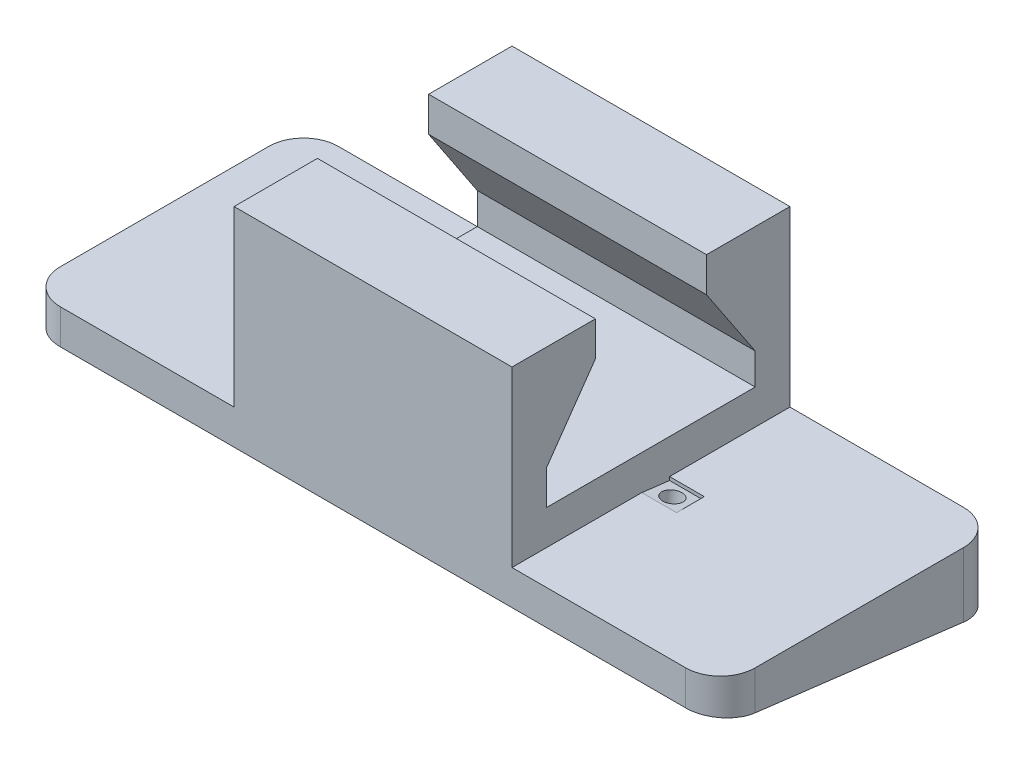
ISO-10303-21;
HEADER;
FILE_DESCRIPTION(('STEP AP214'),'2;1');
FILE_NAME('part.step','',(''),(''),'','','');
FILE_SCHEMA(('AUTOMOTIVE_DESIGN { 1 0 10303 214 1 1 1 1 }'));
ENDSEC;
DATA;
#1=APPLICATION_CONTEXT('core data for automotive mechanical design processes');
#2=APPLICATION_PROTOCOL_DEFINITION('international standard','automotive_design',2000,#1);
#3=PRODUCT_CONTEXT('',#1,'mechanical');
#4=PRODUCT('Part','Part','',(#3));
#5=PRODUCT_RELATED_PRODUCT_CATEGORY('part','',(#4));
#6=PRODUCT_DEFINITION_FORMATION('','',#4);
#7=PRODUCT_DEFINITION_CONTEXT('part definition',#1,'design');
#8=PRODUCT_DEFINITION('design','',#6,#7);
#9=PRODUCT_DEFINITION_SHAPE('','',#8);
#10=(LENGTH_UNIT() NAMED_UNIT(*) SI_UNIT(.MILLI.,.METRE.));
#11=(NAMED_UNIT(*) PLANE_ANGLE_UNIT() SI_UNIT($,.RADIAN.));
#12=(NAMED_UNIT(*) SI_UNIT($,.STERADIAN.) SOLID_ANGLE_UNIT());
#13=UNCERTAINTY_MEASURE_WITH_UNIT(LENGTH_MEASURE(1.E-05),#10,'distance_accuracy_value','');
#14=(GEOMETRIC_REPRESENTATION_CONTEXT(3) GLOBAL_UNCERTAINTY_ASSIGNED_CONTEXT((#13)) GLOBAL_UNIT_ASSIGNED_CONTEXT((#10,
#11,#12)) REPRESENTATION_CONTEXT('',''));
#15=CARTESIAN_POINT('',(0.,0.,0.));
#16=DIRECTION('',(0.,0.,1.));
#17=DIRECTION('',(1.,0.,0.));
#18=AXIS2_PLACEMENT_3D('',#15,#16,#17);
#19=CARTESIAN_POINT('',(19.9999999999999,5.,1.32059979258647));
#20=DIRECTION('',(0.,-0.992546151641323,0.121869343405141));
#21=DIRECTION('',(0.,-0.121869343405141,-0.992546151641323));
#22=AXIS2_PLACEMENT_3D('',#19,#20,#21);
#23=PLANE('',#22);
#24=CARTESIAN_POINT('',(22.5,4.76599831311448,-0.585191010139714));
#25=DIRECTION('',(0.,-0.992546151641323,0.121869343405141));
#26=DIRECTION('',(0.,-0.121869343405141,-0.992546151641323));
#27=AXIS2_PLACEMENT_3D('',#24,#25,#26);
#28=CIRCLE('',#27,1.4);
#29=CARTESIAN_POINT('',(22.5,4.59538123234729,-1.97475562243757));
#30=VERTEX_POINT('',#29);
#31=EDGE_CURVE('E303',#30,#30,#28,.F.);
#32=ORIENTED_EDGE('',*,*,#31,.F.);
#33=EDGE_LOOP('',(#32));
#34=FACE_BOUND('',#33,.T.);
#35=DIRECTION('',(0.,-0.121869343405141,-0.992546151641323));
#36=VECTOR('',#35,1.);
#37=CARTESIAN_POINT('',(24.9999999999999,5.,1.32059979258647));
#38=LINE('',#37,#36);
#39=CARTESIAN_POINT('',(24.9999999999999,5.,1.32059979258647));
#40=VERTEX_POINT('',#39);
#41=CARTESIAN_POINT('',(24.9999999999999,4.50886175638841,-2.67940020741353));
#42=VERTEX_POINT('',#41);
#43=EDGE_CURVE('E557',#40,#42,#38,.T.);
#44=ORIENTED_EDGE('',*,*,#43,.T.);
#45=DIRECTION('',(1.,0.,0.));
#46=VECTOR('',#45,1.);
#47=CARTESIAN_POINT('',(19.9999999999999,4.50886175638841,-2.67940020741353));
#48=LINE('',#47,#46);
#49=CARTESIAN_POINT('',(19.9999999999999,4.50886175638841,-2.67940020741353));
#50=VERTEX_POINT('',#49);
#51=EDGE_CURVE('E222',#50,#42,#48,.T.);
#52=ORIENTED_EDGE('',*,*,#51,.F.);
#53=DIRECTION('',(0.,-0.121869343405141,-0.992546151641323));
#54=VECTOR('',#53,1.);
#55=CARTESIAN_POINT('',(19.9999999999999,5.,1.32059979258647));
#56=LINE('',#55,#54);
#57=CARTESIAN_POINT('',(19.9999999999999,5.,1.32059979258647));
#58=VERTEX_POINT('',#57);
#59=EDGE_CURVE('E217',#58,#50,#56,.T.);
#60=ORIENTED_EDGE('',*,*,#59,.F.);
#61=DIRECTION('',(1.,0.,0.));
#62=VECTOR('',#61,1.);
#63=CARTESIAN_POINT('',(19.9999999999999,5.,1.32059979258647));
#64=LINE('',#63,#62);
#65=EDGE_CURVE('E219',#58,#40,#64,.T.);
#66=ORIENTED_EDGE('',*,*,#65,.T.);
#67=EDGE_LOOP('',(#44,#52,#60,#66));
#68=FACE_BOUND('',#67,.T.);
#69=ADVANCED_FACE('F42',(#34,#68),#23,.F.);
#70=CARTESIAN_POINT('',(19.9999999999999,4.50886175638841,-2.67940020741353));
#71=DIRECTION('',(0.,0.,-1.));
#72=DIRECTION('',(-1.,0.,0.));
#73=AXIS2_PLACEMENT_3D('',#70,#71,#72);
#74=PLANE('',#73);
#75=DIRECTION('',(0.,1.,0.));
#76=VECTOR('',#75,1.);
#77=CARTESIAN_POINT('',(24.9999999999999,4.50886175638841,-2.67940020741353));
#78=LINE('',#77,#76);
#79=CARTESIAN_POINT('',(24.9999999999999,5.,-2.67940020741353));
#80=VERTEX_POINT('',#79);
#81=EDGE_CURVE('E556',#42,#80,#78,.T.);
#82=ORIENTED_EDGE('',*,*,#81,.T.);
#83=DIRECTION('',(1.,0.,0.));
#84=VECTOR('',#83,1.);
#85=CARTESIAN_POINT('',(19.9999999999999,5.,-2.67940020741353));
#86=LINE('',#85,#84);
#87=CARTESIAN_POINT('',(20.,5.,-2.67940020741353));
#88=VERTEX_POINT('',#87);
#89=EDGE_CURVE('E227',#88,#80,#86,.T.);
#90=ORIENTED_EDGE('',*,*,#89,.F.);
#91=DIRECTION('',(0.,1.,0.));
#92=VECTOR('',#91,1.);
#93=CARTESIAN_POINT('',(19.9999999999999,4.50886175638841,-2.67940020741353));
#94=LINE('',#93,#92);
#95=EDGE_CURVE('E228',#50,#88,#94,.T.);
#96=ORIENTED_EDGE('',*,*,#95,.F.);
#97=ORIENTED_EDGE('',*,*,#51,.T.);
#98=EDGE_LOOP('',(#82,#90,#96,#97));
#99=FACE_BOUND('',#98,.T.);
#100=ADVANCED_FACE('F611',(#99),#74,.F.);
#101=CARTESIAN_POINT('',(-20.0000000000001,4.50886175638838,-2.65364059148094));
#102=DIRECTION('',(0.,-0.992546151641322,0.121869343405148));
#103=DIRECTION('',(0.,-0.121869343405148,-0.992546151641322));
#104=AXIS2_PLACEMENT_3D('',#101,#102,#103);
#105=PLANE('',#104);
#106=CARTESIAN_POINT('',(-22.5,4.76288240555631,-0.584808424798369));
#107=DIRECTION('',(0.,-0.992546151641322,0.121869343405148));
#108=DIRECTION('',(0.,-0.121869343405148,-0.992546151641322));
#109=AXIS2_PLACEMENT_3D('',#106,#107,#108);
#110=CIRCLE('',#109,1.4);
#111=CARTESIAN_POINT('',(-22.5,4.5922653247891,-1.97437303709622));
#112=VERTEX_POINT('',#111);
#113=EDGE_CURVE('E297',#112,#112,#110,.F.);
#114=ORIENTED_EDGE('',*,*,#113,.F.);
#115=EDGE_LOOP('',(#114));
#116=FACE_BOUND('',#115,.T.);
#117=DIRECTION('',(0.,0.121869343405148,0.992546151641322));
#118=VECTOR('',#117,1.);
#119=CARTESIAN_POINT('',(-25.0000000000001,4.50886175638838,-2.65364059148094));
#120=LINE('',#119,#118);
#121=CARTESIAN_POINT('',(-25.0000000000001,4.50886175638838,-2.65364059148094));
#122=VERTEX_POINT('',#121);
#123=CARTESIAN_POINT('',(-25.0000000000001,5.,1.34635940851906));
#124=VERTEX_POINT('',#123);
#125=EDGE_CURVE('E574',#122,#124,#120,.T.);
#126=ORIENTED_EDGE('',*,*,#125,.T.);
#127=DIRECTION('',(-1.,0.,0.));
#128=VECTOR('',#127,1.);
#129=CARTESIAN_POINT('',(-20.0000000000001,5.,1.34635940851906));
#130=LINE('',#129,#128);
#131=CARTESIAN_POINT('',(-20.,5.,1.34635940851906));
#132=VERTEX_POINT('',#131);
#133=EDGE_CURVE('E584',#132,#124,#130,.T.);
#134=ORIENTED_EDGE('',*,*,#133,.F.);
#135=DIRECTION('',(0.,0.121869343405148,0.992546151641322));
#136=VECTOR('',#135,1.);
#137=CARTESIAN_POINT('',(-20.0000000000001,4.50886175638838,-2.65364059148094));
#138=LINE('',#137,#136);
#139=CARTESIAN_POINT('',(-20.0000000000001,4.50886175638838,-2.65364059148094));
#140=VERTEX_POINT('',#139);
#141=EDGE_CURVE('E542',#140,#132,#138,.T.);
#142=ORIENTED_EDGE('',*,*,#141,.F.);
#143=DIRECTION('',(-1.,0.,0.));
#144=VECTOR('',#143,1.);
#145=CARTESIAN_POINT('',(-20.0000000000001,4.50886175638838,-2.65364059148094));
#146=LINE('',#145,#144);
#147=EDGE_CURVE('E581',#140,#122,#146,.T.);
#148=ORIENTED_EDGE('',*,*,#147,.T.);
#149=EDGE_LOOP('',(#126,#134,#142,#148));
#150=FACE_BOUND('',#149,.T.);
#151=ADVANCED_FACE('F617',(#116,#150),#105,.F.);
#152=CARTESIAN_POINT('',(-20.0000000000001,5.,-2.65364059148094));
#153=DIRECTION('',(0.,0.,-1.));
#154=DIRECTION('',(0.,1.,0.));
#155=AXIS2_PLACEMENT_3D('',#152,#153,#154);
#156=PLANE('',#155);
#157=DIRECTION('',(0.,-1.,0.));
#158=VECTOR('',#157,1.);
#159=CARTESIAN_POINT('',(-25.0000000000001,5.,-2.65364059148094));
#160=LINE('',#159,#158);
#161=CARTESIAN_POINT('',(-25.0000000000001,5.,-2.65364059148094));
#162=VERTEX_POINT('',#161);
#163=EDGE_CURVE('E571',#162,#122,#160,.T.);
#164=ORIENTED_EDGE('',*,*,#163,.T.);
#165=ORIENTED_EDGE('',*,*,#147,.F.);
#166=DIRECTION('',(0.,-1.,0.));
#167=VECTOR('',#166,1.);
#168=CARTESIAN_POINT('',(-20.0000000000001,5.,-2.65364059148094));
#169=LINE('',#168,#167);
#170=CARTESIAN_POINT('',(-20.0000000000001,5.,-2.65364059148094));
#171=VERTEX_POINT('',#170);
#172=EDGE_CURVE('E546',#171,#140,#169,.T.);
#173=ORIENTED_EDGE('',*,*,#172,.F.);
#174=DIRECTION('',(-1.,0.,0.));
#175=VECTOR('',#174,1.);
#176=CARTESIAN_POINT('',(-20.0000000000001,5.,-2.65364059148094));
#177=LINE('',#176,#175);
#178=EDGE_CURVE('E302',#171,#162,#177,.T.);
#179=ORIENTED_EDGE('',*,*,#178,.T.);
#180=EDGE_LOOP('',(#164,#165,#173,#179));
#181=FACE_BOUND('',#180,.T.);
#182=ADVANCED_FACE('F628',(#181),#156,.F.);
#183=CARTESIAN_POINT('',(0.,10.,0.));
#184=DIRECTION('',(0.,1.,0.));
#185=DIRECTION('',(0.,0.,1.));
#186=AXIS2_PLACEMENT_3D('',#183,#184,#185);
#187=PLANE('',#186);
#188=DIRECTION('',(0.,0.,1.));
#189=VECTOR('',#188,1.);
#190=CARTESIAN_POINT('',(-20.,10.,-20.));
#191=LINE('',#190,#189);
#192=CARTESIAN_POINT('',(-20.,10.,-15.));
#193=VERTEX_POINT('',#192);
#194=CARTESIAN_POINT('',(-20.,10.,15.));
#195=VERTEX_POINT('',#194);
#196=EDGE_CURVE('E244',#193,#195,#191,.T.);
#197=ORIENTED_EDGE('',*,*,#196,.T.);
#198=DIRECTION('',(1.,0.,0.));
#199=VECTOR('',#198,1.);
#200=CARTESIAN_POINT('',(-50.,10.,15.));
#201=LINE('',#200,#199);
#202=CARTESIAN_POINT('',(20.,10.,15.));
#203=VERTEX_POINT('',#202);
#204=EDGE_CURVE('E400',#195,#203,#201,.T.);
#205=ORIENTED_EDGE('',*,*,#204,.T.);
#206=DIRECTION('',(0.,0.,-1.));
#207=VECTOR('',#206,1.);
#208=CARTESIAN_POINT('',(20.,10.,20.));
#209=LINE('',#208,#207);
#210=CARTESIAN_POINT('',(20.,10.,-15.));
#211=VERTEX_POINT('',#210);
#212=EDGE_CURVE('E249',#203,#211,#209,.T.);
#213=ORIENTED_EDGE('',*,*,#212,.T.);
#214=DIRECTION('',(1.,0.,0.));
#215=VECTOR('',#214,1.);
#216=CARTESIAN_POINT('',(-50.,10.,-15.));
#217=LINE('',#216,#215);
#218=EDGE_CURVE('E413',#193,#211,#217,.T.);
#219=ORIENTED_EDGE('',*,*,#218,.F.);
#220=EDGE_LOOP('',(#197,#205,#213,#219));
#221=FACE_BOUND('',#220,.T.);
#222=ADVANCED_FACE('F482',(#221),#187,.T.);
#223=CARTESIAN_POINT('',(0.,5.,0.));
#224=DIRECTION('',(0.,1.,0.));
#225=DIRECTION('',(0.,0.,1.));
#226=AXIS2_PLACEMENT_3D('',#223,#224,#225);
#227=PLANE('',#226);
#228=DIRECTION('',(1.,0.,0.));
#229=VECTOR('',#228,1.);
#230=CARTESIAN_POINT('',(0.,5.,20.));
#231=LINE('',#230,#229);
#232=CARTESIAN_POINT('',(20.,5.,20.));
#233=VERTEX_POINT('',#232);
#234=CARTESIAN_POINT('',(44.9999999999999,5.,20.));
#235=VERTEX_POINT('',#234);
#236=EDGE_CURVE('E278',#233,#235,#231,.T.);
#237=ORIENTED_EDGE('',*,*,#236,.T.);
#238=CARTESIAN_POINT('',(44.9999999999999,5.,15.));
#239=DIRECTION('',(0.,1.,0.));
#240=DIRECTION('',(0.,0.,1.));
#241=AXIS2_PLACEMENT_3D('',#238,#239,#240);
#242=CIRCLE('',#241,5.);
#243=CARTESIAN_POINT('',(49.9999999999999,5.,15.));
#244=VERTEX_POINT('',#243);
#245=EDGE_CURVE('E64',#235,#244,#242,.T.);
#246=ORIENTED_EDGE('',*,*,#245,.T.);
#247=DIRECTION('',(0.,0.,1.));
#248=VECTOR('',#247,1.);
#249=CARTESIAN_POINT('',(49.9999999999999,5.,0.));
#250=LINE('',#249,#248);
#251=CARTESIAN_POINT('',(49.9999999999999,5.,-15.));
#252=VERTEX_POINT('',#251);
#253=EDGE_CURVE('E282',#252,#244,#250,.T.);
#254=ORIENTED_EDGE('',*,*,#253,.F.);
#255=CARTESIAN_POINT('',(44.9999999999999,5.,-15.));
#256=DIRECTION('',(0.,1.,0.));
#257=DIRECTION('',(0.,0.,1.));
#258=AXIS2_PLACEMENT_3D('',#255,#256,#257);
#259=CIRCLE('',#258,5.);
#260=CARTESIAN_POINT('',(44.9999999999999,5.,-20.));
#261=VERTEX_POINT('',#260);
#262=EDGE_CURVE('E58',#252,#261,#259,.T.);
#263=ORIENTED_EDGE('',*,*,#262,.T.);
#264=DIRECTION('',(1.,0.,0.));
#265=VECTOR('',#264,1.);
#266=CARTESIAN_POINT('',(0.,5.,-20.));
#267=LINE('',#266,#265);
#268=CARTESIAN_POINT('',(20.,5.,-20.));
#269=VERTEX_POINT('',#268);
#270=EDGE_CURVE('E274',#269,#261,#267,.T.);
#271=ORIENTED_EDGE('',*,*,#270,.F.);
#272=DIRECTION('',(0.,0.,-1.));
#273=VECTOR('',#272,1.);
#274=CARTESIAN_POINT('',(20.,5.,20.));
#275=LINE('',#274,#273);
#276=EDGE_CURVE('E245',#88,#269,#275,.T.);
#277=ORIENTED_EDGE('',*,*,#276,.F.);
#278=ORIENTED_EDGE('',*,*,#89,.T.);
#279=DIRECTION('',(0.,0.,1.));
#280=VECTOR('',#279,1.);
#281=CARTESIAN_POINT('',(24.9999999999999,5.,-2.67940020741353));
#282=LINE('',#281,#280);
#283=EDGE_CURVE('E236',#80,#40,#282,.T.);
#284=ORIENTED_EDGE('',*,*,#283,.T.);
#285=ORIENTED_EDGE('',*,*,#65,.F.);
#286=EDGE_CURVE('E232',#233,#58,#275,.T.);
#287=ORIENTED_EDGE('',*,*,#286,.F.);
#288=EDGE_LOOP('',(#237,#246,#254,#263,#271,#277,#278,#284,#285,#287));
#289=FACE_BOUND('',#288,.T.);
#290=ADVANCED_FACE('F231',(#289),#227,.T.);
#291=CARTESIAN_POINT('',(0.,5.,-20.));
#292=DIRECTION('',(0.,0.,-1.));
#293=DIRECTION('',(-1.,0.,0.));
#294=AXIS2_PLACEMENT_3D('',#291,#292,#293);
#295=PLANE('',#294);
#296=ORIENTED_EDGE('',*,*,#270,.T.);
#297=DIRECTION('',(0.,-1.,0.));
#298=VECTOR('',#297,1.);
#299=CARTESIAN_POINT('',(44.9999999999999,5.,-20.));
#300=LINE('',#299,#298);
#301=CARTESIAN_POINT('',(44.9999999999999,-4.91138243611591,-20.));
#302=VERTEX_POINT('',#301);
#303=EDGE_CURVE('E11',#261,#302,#300,.T.);
#304=ORIENTED_EDGE('',*,*,#303,.T.);
#305=DIRECTION('',(-1.,0.,0.));
#306=VECTOR('',#305,1.);
#307=CARTESIAN_POINT('',(49.9999999999999,-4.91138243611591,-20.));
#308=LINE('',#307,#306);
#309=CARTESIAN_POINT('',(-45.0000000000001,-4.91138243611591,-20.));
#310=VERTEX_POINT('',#309);
#311=EDGE_CURVE('E357',#302,#310,#308,.T.);
#312=ORIENTED_EDGE('',*,*,#311,.T.);
#313=DIRECTION('',(0.,-1.,0.));
#314=VECTOR('',#313,1.);
#315=CARTESIAN_POINT('',(-45.0000000000001,5.,-20.));
#316=LINE('',#315,#314);
#317=CARTESIAN_POINT('',(-45.0000000000001,5.,-20.));
#318=VERTEX_POINT('',#317);
#319=EDGE_CURVE('E51',#310,#318,#316,.F.);
#320=ORIENTED_EDGE('',*,*,#319,.T.);
#321=CARTESIAN_POINT('',(-20.,5.,-20.));
#322=VERTEX_POINT('',#321);
#323=EDGE_CURVE('E270',#318,#322,#267,.T.);
#324=ORIENTED_EDGE('',*,*,#323,.T.);
#325=DIRECTION('',(0.,-1.,0.));
#326=VECTOR('',#325,1.);
#327=CARTESIAN_POINT('',(-20.,10.,-20.));
#328=LINE('',#327,#326);
#329=CARTESIAN_POINT('',(-20.,30.,-20.));
#330=VERTEX_POINT('',#329);
#331=EDGE_CURVE('E265',#330,#322,#328,.T.);
#332=ORIENTED_EDGE('',*,*,#331,.F.);
#333=DIRECTION('',(-1.,0.,0.));
#334=VECTOR('',#333,1.);
#335=CARTESIAN_POINT('',(-20.,30.,-20.));
#336=LINE('',#335,#334);
#337=CARTESIAN_POINT('',(20.,30.,-20.));
#338=VERTEX_POINT('',#337);
#339=EDGE_CURVE('E467',#338,#330,#336,.T.);
#340=ORIENTED_EDGE('',*,*,#339,.F.);
#341=DIRECTION('',(0.,-1.,0.));
#342=VECTOR('',#341,1.);
#343=CARTESIAN_POINT('',(20.,10.,-20.));
#344=LINE('',#343,#342);
#345=EDGE_CURVE('E255',#338,#269,#344,.T.);
#346=ORIENTED_EDGE('',*,*,#345,.T.);
#347=EDGE_LOOP('',(#296,#304,#312,#320,#324,#332,#340,#346));
#348=FACE_BOUND('',#347,.T.);
#349=ADVANCED_FACE('F354',(#348),#295,.T.);
#350=CARTESIAN_POINT('',(-50.0000000000001,5.,0.));
#351=DIRECTION('',(1.,0.,0.));
#352=DIRECTION('',(0.,0.,-1.));
#353=AXIS2_PLACEMENT_3D('',#350,#351,#352);
#354=PLANE('',#353);
#355=DIRECTION('',(0.,0.121869343405141,0.992546151641323));
#356=VECTOR('',#355,1.);
#357=CARTESIAN_POINT('',(-50.0000000000001,0.,20.));
#358=LINE('',#357,#356);
#359=CARTESIAN_POINT('',(-50.0000000000001,-4.29745963160143,-15.));
#360=VERTEX_POINT('',#359);
#361=CARTESIAN_POINT('',(-50.0000000000001,-0.61392280451449,15.));
#362=VERTEX_POINT('',#361);
#363=EDGE_CURVE('E370',#360,#362,#358,.T.);
#364=ORIENTED_EDGE('',*,*,#363,.T.);
#365=DIRECTION('',(0.,-1.,0.));
#366=VECTOR('',#365,1.);
#367=CARTESIAN_POINT('',(-50.0000000000001,5.,15.));
#368=LINE('',#367,#366);
#369=CARTESIAN_POINT('',(-50.0000000000001,5.,15.));
#370=VERTEX_POINT('',#369);
#371=EDGE_CURVE('E330',#362,#370,#368,.F.);
#372=ORIENTED_EDGE('',*,*,#371,.T.);
#373=DIRECTION('',(0.,0.,1.));
#374=VECTOR('',#373,1.);
#375=CARTESIAN_POINT('',(-50.0000000000001,5.,0.));
#376=LINE('',#375,#374);
#377=CARTESIAN_POINT('',(-50.0000000000001,5.,-15.));
#378=VERTEX_POINT('',#377);
#379=EDGE_CURVE('E273',#378,#370,#376,.T.);
#380=ORIENTED_EDGE('',*,*,#379,.F.);
#381=DIRECTION('',(0.,-1.,0.));
#382=VECTOR('',#381,1.);
#383=CARTESIAN_POINT('',(-50.0000000000001,-4.91138243611591,-15.));
#384=LINE('',#383,#382);
#385=EDGE_CURVE('E326',#378,#360,#384,.T.);
#386=ORIENTED_EDGE('',*,*,#385,.T.);
#387=EDGE_LOOP('',(#364,#372,#380,#386));
#388=FACE_BOUND('',#387,.T.);
#389=ADVANCED_FACE('F369',(#388),#354,.F.);
#390=CARTESIAN_POINT('',(0.,5.,20.));
#391=DIRECTION('',(0.,0.,-1.));
#392=DIRECTION('',(-1.,0.,0.));
#393=AXIS2_PLACEMENT_3D('',#390,#391,#392);
#394=PLANE('',#393);
#395=CARTESIAN_POINT('',(-45.0000000000001,5.,20.));
#396=VERTEX_POINT('',#395);
#397=CARTESIAN_POINT('',(-20.,5.,20.));
#398=VERTEX_POINT('',#397);
#399=EDGE_CURVE('E279',#396,#398,#231,.T.);
#400=ORIENTED_EDGE('',*,*,#399,.F.);
#401=DIRECTION('',(0.,-1.,0.));
#402=VECTOR('',#401,1.);
#403=CARTESIAN_POINT('',(-45.0000000000001,5.,20.));
#404=LINE('',#403,#402);
#405=CARTESIAN_POINT('',(-45.0000000000001,0.,20.));
#406=VERTEX_POINT('',#405);
#407=EDGE_CURVE('E310',#396,#406,#404,.T.);
#408=ORIENTED_EDGE('',*,*,#407,.T.);
#409=DIRECTION('',(1.,0.,0.));
#410=VECTOR('',#409,1.);
#411=CARTESIAN_POINT('',(0.,0.,20.));
#412=LINE('',#411,#410);
#413=CARTESIAN_POINT('',(44.9999999999999,0.,20.));
#414=VERTEX_POINT('',#413);
#415=EDGE_CURVE('E269',#406,#414,#412,.T.);
#416=ORIENTED_EDGE('',*,*,#415,.T.);
#417=DIRECTION('',(0.,-1.,0.));
#418=VECTOR('',#417,1.);
#419=CARTESIAN_POINT('',(44.9999999999999,5.,20.));
#420=LINE('',#419,#418);
#421=EDGE_CURVE('E296',#414,#235,#420,.F.);
#422=ORIENTED_EDGE('',*,*,#421,.T.);
#423=ORIENTED_EDGE('',*,*,#236,.F.);
#424=DIRECTION('',(0.,-1.,0.));
#425=VECTOR('',#424,1.);
#426=CARTESIAN_POINT('',(20.,10.,20.));
#427=LINE('',#426,#425);
#428=CARTESIAN_POINT('',(20.,30.,20.));
#429=VERTEX_POINT('',#428);
#430=EDGE_CURVE('E242',#429,#233,#427,.T.);
#431=ORIENTED_EDGE('',*,*,#430,.F.);
#432=DIRECTION('',(1.,0.,0.));
#433=VECTOR('',#432,1.);
#434=CARTESIAN_POINT('',(-20.,30.,20.));
#435=LINE('',#434,#433);
#436=CARTESIAN_POINT('',(-20.,30.,20.));
#437=VERTEX_POINT('',#436);
#438=EDGE_CURVE('E438',#437,#429,#435,.T.);
#439=ORIENTED_EDGE('',*,*,#438,.F.);
#440=DIRECTION('',(0.,-1.,0.));
#441=VECTOR('',#440,1.);
#442=CARTESIAN_POINT('',(-20.,10.,20.));
#443=LINE('',#442,#441);
#444=EDGE_CURVE('E261',#437,#398,#443,.T.);
#445=ORIENTED_EDGE('',*,*,#444,.T.);
#446=EDGE_LOOP('',(#400,#408,#416,#422,#423,#431,#439,#445));
#447=FACE_BOUND('',#446,.T.);
#448=ADVANCED_FACE('F517',(#447),#394,.F.);
#449=CARTESIAN_POINT('',(49.9999999999999,5.,0.));
#450=DIRECTION('',(1.,0.,0.));
#451=DIRECTION('',(0.,0.,-1.));
#452=AXIS2_PLACEMENT_3D('',#449,#450,#451);
#453=PLANE('',#452);
#454=ORIENTED_EDGE('',*,*,#253,.T.);
#455=DIRECTION('',(0.,-1.,0.));
#456=VECTOR('',#455,1.);
#457=CARTESIAN_POINT('',(49.9999999999999,0.,15.));
#458=LINE('',#457,#456);
#459=CARTESIAN_POINT('',(49.9999999999999,-0.613922804514489,15.));
#460=VERTEX_POINT('',#459);
#461=EDGE_CURVE('E342',#244,#460,#458,.T.);
#462=ORIENTED_EDGE('',*,*,#461,.T.);
#463=DIRECTION('',(0.,0.121869343405141,0.992546151641323));
#464=VECTOR('',#463,1.);
#465=CARTESIAN_POINT('',(49.9999999999999,0.,20.));
#466=LINE('',#465,#464);
#467=CARTESIAN_POINT('',(49.9999999999999,-4.29745963160143,-15.));
#468=VERTEX_POINT('',#467);
#469=EDGE_CURVE('E376',#468,#460,#466,.T.);
#470=ORIENTED_EDGE('',*,*,#469,.F.);
#471=DIRECTION('',(0.,-1.,0.));
#472=VECTOR('',#471,1.);
#473=CARTESIAN_POINT('',(49.9999999999999,5.,-15.));
#474=LINE('',#473,#472);
#475=EDGE_CURVE('E339',#468,#252,#474,.F.);
#476=ORIENTED_EDGE('',*,*,#475,.T.);
#477=EDGE_LOOP('',(#454,#462,#470,#476));
#478=FACE_BOUND('',#477,.T.);
#479=ADVANCED_FACE('F529',(#478),#453,.T.);
#480=ORIENTED_EDGE('',*,*,#379,.T.);
#481=CARTESIAN_POINT('',(-45.0000000000001,5.,15.));
#482=DIRECTION('',(0.,1.,0.));
#483=DIRECTION('',(0.,0.,1.));
#484=AXIS2_PLACEMENT_3D('',#481,#482,#483);
#485=CIRCLE('',#484,5.);
#486=EDGE_CURVE('E336',#370,#396,#485,.T.);
#487=ORIENTED_EDGE('',*,*,#486,.T.);
#488=ORIENTED_EDGE('',*,*,#399,.T.);
#489=DIRECTION('',(0.,0.,1.));
#490=VECTOR('',#489,1.);
#491=CARTESIAN_POINT('',(-20.,5.,-20.));
#492=LINE('',#491,#490);
#493=EDGE_CURVE('E478',#132,#398,#492,.T.);
#494=ORIENTED_EDGE('',*,*,#493,.F.);
#495=ORIENTED_EDGE('',*,*,#133,.T.);
#496=DIRECTION('',(0.,0.,-1.));
#497=VECTOR('',#496,1.);
#498=CARTESIAN_POINT('',(-25.0000000000001,5.,1.34635940851907));
#499=LINE('',#498,#497);
#500=EDGE_CURVE('E307',#124,#162,#499,.T.);
#501=ORIENTED_EDGE('',*,*,#500,.T.);
#502=ORIENTED_EDGE('',*,*,#178,.F.);
#503=EDGE_CURVE('E251',#322,#171,#492,.T.);
#504=ORIENTED_EDGE('',*,*,#503,.F.);
#505=ORIENTED_EDGE('',*,*,#323,.F.);
#506=CARTESIAN_POINT('',(-45.0000000000001,5.,-15.));
#507=DIRECTION('',(0.,1.,0.));
#508=DIRECTION('',(0.,0.,1.));
#509=AXIS2_PLACEMENT_3D('',#506,#507,#508);
#510=CIRCLE('',#509,5.);
#511=EDGE_CURVE('E333',#318,#378,#510,.T.);
#512=ORIENTED_EDGE('',*,*,#511,.T.);
#513=EDGE_LOOP('',(#480,#487,#488,#494,#495,#501,#502,#504,#505,#512));
#514=FACE_BOUND('',#513,.T.);
#515=ADVANCED_FACE('F361',(#514),#227,.T.);
#516=CARTESIAN_POINT('',(-20.,10.,-20.));
#517=DIRECTION('',(1.,0.,0.));
#518=DIRECTION('',(0.,0.,-1.));
#519=AXIS2_PLACEMENT_3D('',#516,#517,#518);
#520=PLANE('',#519);
#521=DIRECTION('',(0.,-1.,0.));
#522=VECTOR('',#521,1.);
#523=CARTESIAN_POINT('',(-20.,10.,15.));
#524=LINE('',#523,#522);
#525=CARTESIAN_POINT('',(-20.,15.,15.));
#526=VERTEX_POINT('',#525);
#527=EDGE_CURVE('E430',#526,#195,#524,.T.);
#528=ORIENTED_EDGE('',*,*,#527,.T.);
#529=ORIENTED_EDGE('',*,*,#196,.F.);
#530=DIRECTION('',(0.,1.,0.));
#531=VECTOR('',#530,1.);
#532=CARTESIAN_POINT('',(-20.,10.,-15.));
#533=LINE('',#532,#531);
#534=CARTESIAN_POINT('',(-20.,14.5,-15.));
#535=VERTEX_POINT('',#534);
#536=EDGE_CURVE('E426',#193,#535,#533,.T.);
#537=ORIENTED_EDGE('',*,*,#536,.T.);
#538=DIRECTION('',(0.,0.832050294337844,0.554700196225229));
#539=VECTOR('',#538,1.);
#540=CARTESIAN_POINT('',(-20.,9.07692307692308,-18.6153846153846));
#541=LINE('',#540,#539);
#542=CARTESIAN_POINT('',(-20.,25.,-8.));
#543=VERTEX_POINT('',#542);
#544=EDGE_CURVE('E422',#535,#543,#541,.T.);
#545=ORIENTED_EDGE('',*,*,#544,.T.);
#546=DIRECTION('',(0.,-1.,0.));
#547=VECTOR('',#546,1.);
#548=CARTESIAN_POINT('',(-20.,30.,-8.00000000000001));
#549=LINE('',#548,#547);
#550=CARTESIAN_POINT('',(-20.,30.,-8.00000000000001));
#551=VERTEX_POINT('',#550);
#552=EDGE_CURVE('E475',#551,#543,#549,.T.);
#553=ORIENTED_EDGE('',*,*,#552,.F.);
#554=DIRECTION('',(0.,0.,1.));
#555=VECTOR('',#554,1.);
#556=CARTESIAN_POINT('',(-20.,30.,-20.));
#557=LINE('',#556,#555);
#558=EDGE_CURVE('E456',#330,#551,#557,.T.);
#559=ORIENTED_EDGE('',*,*,#558,.F.);
#560=ORIENTED_EDGE('',*,*,#331,.T.);
#561=ORIENTED_EDGE('',*,*,#503,.T.);
#562=ORIENTED_EDGE('',*,*,#172,.T.);
#563=ORIENTED_EDGE('',*,*,#141,.T.);
#564=ORIENTED_EDGE('',*,*,#493,.T.);
#565=ORIENTED_EDGE('',*,*,#444,.F.);
#566=DIRECTION('',(0.,0.,1.));
#567=VECTOR('',#566,1.);
#568=CARTESIAN_POINT('',(-20.,30.,8.));
#569=LINE('',#568,#567);
#570=CARTESIAN_POINT('',(-20.,30.,8.));
#571=VERTEX_POINT('',#570);
#572=EDGE_CURVE('E434',#571,#437,#569,.T.);
#573=ORIENTED_EDGE('',*,*,#572,.F.);
#574=DIRECTION('',(0.,-1.,0.));
#575=VECTOR('',#574,1.);
#576=CARTESIAN_POINT('',(-20.,30.,8.));
#577=LINE('',#576,#575);
#578=CARTESIAN_POINT('',(-20.,25.,8.));
#579=VERTEX_POINT('',#578);
#580=EDGE_CURVE('E448',#571,#579,#577,.T.);
#581=ORIENTED_EDGE('',*,*,#580,.T.);
#582=DIRECTION('',(0.,-0.819231920519041,0.573462344363328));
#583=VECTOR('',#582,1.);
#584=CARTESIAN_POINT('',(-20.,28.0872483221476,5.83892617449665));
#585=LINE('',#584,#583);
#586=EDGE_CURVE('E404',#579,#526,#585,.T.);
#587=ORIENTED_EDGE('',*,*,#586,.T.);
#588=EDGE_LOOP('',(#528,#529,#537,#545,#553,#559,#560,#561,#562,#563,#564,#565,#573,#581,#587));
#589=FACE_BOUND('',#588,.T.);
#590=ADVANCED_FACE('F500',(#589),#520,.F.);
#591=CARTESIAN_POINT('',(20.,10.,20.));
#592=DIRECTION('',(-1.,0.,0.));
#593=DIRECTION('',(0.,0.,1.));
#594=AXIS2_PLACEMENT_3D('',#591,#592,#593);
#595=PLANE('',#594);
#596=ORIENTED_EDGE('',*,*,#212,.F.);
#597=DIRECTION('',(0.,-1.,0.));
#598=VECTOR('',#597,1.);
#599=CARTESIAN_POINT('',(20.,10.,15.));
#600=LINE('',#599,#598);
#601=CARTESIAN_POINT('',(20.,15.,15.));
#602=VERTEX_POINT('',#601);
#603=EDGE_CURVE('E394',#602,#203,#600,.T.);
#604=ORIENTED_EDGE('',*,*,#603,.F.);
#605=DIRECTION('',(0.,-0.819231920519041,0.573462344363328));
#606=VECTOR('',#605,1.);
#607=CARTESIAN_POINT('',(20.,15.,15.));
#608=LINE('',#607,#606);
#609=CARTESIAN_POINT('',(20.,25.,8.));
#610=VERTEX_POINT('',#609);
#611=EDGE_CURVE('E390',#610,#602,#608,.T.);
#612=ORIENTED_EDGE('',*,*,#611,.F.);
#613=DIRECTION('',(0.,-1.,0.));
#614=VECTOR('',#613,1.);
#615=CARTESIAN_POINT('',(20.,30.,8.));
#616=LINE('',#615,#614);
#617=CARTESIAN_POINT('',(20.,30.,8.));
#618=VERTEX_POINT('',#617);
#619=EDGE_CURVE('E452',#618,#610,#616,.T.);
#620=ORIENTED_EDGE('',*,*,#619,.F.);
#621=DIRECTION('',(0.,0.,-1.));
#622=VECTOR('',#621,1.);
#623=CARTESIAN_POINT('',(20.,30.,8.));
#624=LINE('',#623,#622);
#625=EDGE_CURVE('E442',#429,#618,#624,.T.);
#626=ORIENTED_EDGE('',*,*,#625,.F.);
#627=ORIENTED_EDGE('',*,*,#430,.T.);
#628=ORIENTED_EDGE('',*,*,#286,.T.);
#629=ORIENTED_EDGE('',*,*,#59,.T.);
#630=ORIENTED_EDGE('',*,*,#95,.T.);
#631=ORIENTED_EDGE('',*,*,#276,.T.);
#632=ORIENTED_EDGE('',*,*,#345,.F.);
#633=DIRECTION('',(0.,0.,-1.));
#634=VECTOR('',#633,1.);
#635=CARTESIAN_POINT('',(20.,30.,-20.));
#636=LINE('',#635,#634);
#637=CARTESIAN_POINT('',(20.,30.,-8.00000000000001));
#638=VERTEX_POINT('',#637);
#639=EDGE_CURVE('E463',#638,#338,#636,.T.);
#640=ORIENTED_EDGE('',*,*,#639,.F.);
#641=DIRECTION('',(0.,-1.,0.));
#642=VECTOR('',#641,1.);
#643=CARTESIAN_POINT('',(20.,30.,-8.00000000000001));
#644=LINE('',#643,#642);
#645=CARTESIAN_POINT('',(20.,25.,-8.));
#646=VERTEX_POINT('',#645);
#647=EDGE_CURVE('E471',#638,#646,#644,.T.);
#648=ORIENTED_EDGE('',*,*,#647,.T.);
#649=DIRECTION('',(0.,0.832050294337844,0.554700196225229));
#650=VECTOR('',#649,1.);
#651=CARTESIAN_POINT('',(20.,14.5,-15.));
#652=LINE('',#651,#650);
#653=CARTESIAN_POINT('',(20.,14.5,-15.));
#654=VERTEX_POINT('',#653);
#655=EDGE_CURVE('E410',#654,#646,#652,.T.);
#656=ORIENTED_EDGE('',*,*,#655,.F.);
#657=DIRECTION('',(0.,1.,0.));
#658=VECTOR('',#657,1.);
#659=CARTESIAN_POINT('',(20.,10.,-15.));
#660=LINE('',#659,#658);
#661=EDGE_CURVE('E389',#211,#654,#660,.T.);
#662=ORIENTED_EDGE('',*,*,#661,.F.);
#663=EDGE_LOOP('',(#596,#604,#612,#620,#626,#627,#628,#629,#630,#631,#632,#640,#648,#656,#662));
#664=FACE_BOUND('',#663,.T.);
#665=ADVANCED_FACE('F240',(#664),#595,.F.);
#666=CARTESIAN_POINT('',(-20.,30.,-8.00000000000001));
#667=DIRECTION('',(0.,0.,-1.));
#668=DIRECTION('',(-1.,0.,0.));
#669=AXIS2_PLACEMENT_3D('',#666,#667,#668);
#670=PLANE('',#669);
#671=ORIENTED_EDGE('',*,*,#552,.T.);
#672=DIRECTION('',(1.,0.,0.));
#673=VECTOR('',#672,1.);
#674=CARTESIAN_POINT('',(-20.,25.,-8.00000000000001));
#675=LINE('',#674,#673);
#676=EDGE_CURVE('E292',#543,#646,#675,.T.);
#677=ORIENTED_EDGE('',*,*,#676,.T.);
#678=ORIENTED_EDGE('',*,*,#647,.F.);
#679=DIRECTION('',(1.,0.,0.));
#680=VECTOR('',#679,1.);
#681=CARTESIAN_POINT('',(-20.,30.,-8.00000000000001));
#682=LINE('',#681,#680);
#683=EDGE_CURVE('E460',#551,#638,#682,.T.);
#684=ORIENTED_EDGE('',*,*,#683,.F.);
#685=EDGE_LOOP('',(#671,#677,#678,#684));
#686=FACE_BOUND('',#685,.T.);
#687=ADVANCED_FACE('F496',(#686),#670,.F.);
#688=CARTESIAN_POINT('',(0.,30.,0.));
#689=DIRECTION('',(0.,1.,0.));
#690=DIRECTION('',(0.,0.,1.));
#691=AXIS2_PLACEMENT_3D('',#688,#689,#690);
#692=PLANE('',#691);
#693=ORIENTED_EDGE('',*,*,#558,.T.);
#694=ORIENTED_EDGE('',*,*,#683,.T.);
#695=ORIENTED_EDGE('',*,*,#639,.T.);
#696=ORIENTED_EDGE('',*,*,#339,.T.);
#697=EDGE_LOOP('',(#693,#694,#695,#696));
#698=FACE_BOUND('',#697,.T.);
#699=ADVANCED_FACE('F548',(#698),#692,.T.);
#700=CARTESIAN_POINT('',(-20.,30.,8.));
#701=DIRECTION('',(0.,0.,1.));
#702=DIRECTION('',(1.,0.,0.));
#703=AXIS2_PLACEMENT_3D('',#700,#701,#702);
#704=PLANE('',#703);
#705=ORIENTED_EDGE('',*,*,#619,.T.);
#706=DIRECTION('',(-1.,0.,0.));
#707=VECTOR('',#706,1.);
#708=CARTESIAN_POINT('',(-20.,25.,8.));
#709=LINE('',#708,#707);
#710=EDGE_CURVE('E285',#610,#579,#709,.T.);
#711=ORIENTED_EDGE('',*,*,#710,.T.);
#712=ORIENTED_EDGE('',*,*,#580,.F.);
#713=DIRECTION('',(-1.,0.,0.));
#714=VECTOR('',#713,1.);
#715=CARTESIAN_POINT('',(-20.,30.,8.));
#716=LINE('',#715,#714);
#717=EDGE_CURVE('E445',#618,#571,#716,.T.);
#718=ORIENTED_EDGE('',*,*,#717,.F.);
#719=EDGE_LOOP('',(#705,#711,#712,#718));
#720=FACE_BOUND('',#719,.T.);
#721=ADVANCED_FACE('F509',(#720),#704,.F.);
#722=CARTESIAN_POINT('',(0.,30.,0.));
#723=DIRECTION('',(0.,1.,0.));
#724=DIRECTION('',(0.,0.,1.));
#725=AXIS2_PLACEMENT_3D('',#722,#723,#724);
#726=PLANE('',#725);
#727=ORIENTED_EDGE('',*,*,#572,.T.);
#728=ORIENTED_EDGE('',*,*,#438,.T.);
#729=ORIENTED_EDGE('',*,*,#625,.T.);
#730=ORIENTED_EDGE('',*,*,#717,.T.);
#731=EDGE_LOOP('',(#727,#728,#729,#730));
#732=FACE_BOUND('',#731,.T.);
#733=ADVANCED_FACE('F513',(#732),#726,.T.);
#734=CARTESIAN_POINT('',(-50.,10.,15.));
#735=DIRECTION('',(0.,0.,1.));
#736=DIRECTION('',(0.,-1.,0.));
#737=AXIS2_PLACEMENT_3D('',#734,#735,#736);
#738=PLANE('',#737);
#739=DIRECTION('',(1.,0.,0.));
#740=VECTOR('',#739,1.);
#741=CARTESIAN_POINT('',(-50.,15.,15.));
#742=LINE('',#741,#740);
#743=EDGE_CURVE('E399',#526,#602,#742,.T.);
#744=ORIENTED_EDGE('',*,*,#743,.T.);
#745=ORIENTED_EDGE('',*,*,#603,.T.);
#746=ORIENTED_EDGE('',*,*,#204,.F.);
#747=ORIENTED_EDGE('',*,*,#527,.F.);
#748=EDGE_LOOP('',(#744,#745,#746,#747));
#749=FACE_BOUND('',#748,.T.);
#750=ADVANCED_FACE('F502',(#749),#738,.F.);
#751=CARTESIAN_POINT('',(-50.,15.,15.));
#752=DIRECTION('',(0.,0.573462344363328,0.819231920519041));
#753=DIRECTION('',(0.,-0.819231920519041,0.573462344363328));
#754=AXIS2_PLACEMENT_3D('',#751,#752,#753);
#755=PLANE('',#754);
#756=ORIENTED_EDGE('',*,*,#710,.F.);
#757=ORIENTED_EDGE('',*,*,#611,.T.);
#758=ORIENTED_EDGE('',*,*,#743,.F.);
#759=ORIENTED_EDGE('',*,*,#586,.F.);
#760=EDGE_LOOP('',(#756,#757,#758,#759));
#761=FACE_BOUND('',#760,.T.);
#762=ADVANCED_FACE('F794',(#761),#755,.F.);
#763=CARTESIAN_POINT('',(-50.,10.,-15.));
#764=DIRECTION('',(0.,0.,-1.));
#765=DIRECTION('',(0.,1.,0.));
#766=AXIS2_PLACEMENT_3D('',#763,#764,#765);
#767=PLANE('',#766);
#768=ORIENTED_EDGE('',*,*,#218,.T.);
#769=ORIENTED_EDGE('',*,*,#661,.T.);
#770=DIRECTION('',(1.,0.,0.));
#771=VECTOR('',#770,1.);
#772=CARTESIAN_POINT('',(-50.,14.5,-15.));
#773=LINE('',#772,#771);
#774=EDGE_CURVE('E395',#535,#654,#773,.T.);
#775=ORIENTED_EDGE('',*,*,#774,.F.);
#776=ORIENTED_EDGE('',*,*,#536,.F.);
#777=EDGE_LOOP('',(#768,#769,#775,#776));
#778=FACE_BOUND('',#777,.T.);
#779=ADVANCED_FACE('F488',(#778),#767,.F.);
#780=CARTESIAN_POINT('',(-50.,14.5,-15.));
#781=DIRECTION('',(0.,0.554700196225229,-0.832050294337844));
#782=DIRECTION('',(0.,0.832050294337844,0.554700196225229));
#783=AXIS2_PLACEMENT_3D('',#780,#781,#782);
#784=PLANE('',#783);
#785=ORIENTED_EDGE('',*,*,#774,.T.);
#786=ORIENTED_EDGE('',*,*,#655,.T.);
#787=ORIENTED_EDGE('',*,*,#676,.F.);
#788=ORIENTED_EDGE('',*,*,#544,.F.);
#789=EDGE_LOOP('',(#785,#786,#787,#788));
#790=FACE_BOUND('',#789,.T.);
#791=ADVANCED_FACE('F494',(#790),#784,.F.);
#792=CARTESIAN_POINT('',(49.9999999999999,0.,20.));
#793=DIRECTION('',(0.,-0.992546151641323,0.121869343405141));
#794=DIRECTION('',(0.,-0.121869343405141,-0.992546151641323));
#795=AXIS2_PLACEMENT_3D('',#792,#793,#794);
#796=PLANE('',#795);
#797=CARTESIAN_POINT('',(-22.5,-2.41921895599655,0.297042737240004));
#798=DIRECTION('',(0.,-0.992546151641323,0.121869343405141));
#799=DIRECTION('',(0.,-0.121869343405141,-0.992546151641323));
#800=AXIS2_PLACEMENT_3D('',#797,#798,#799);
#801=CIRCLE('',#800,1.4);
#802=CARTESIAN_POINT('',(-22.5,-2.58983603676375,-1.09252187505785));
#803=VERTEX_POINT('',#802);
#804=EDGE_CURVE('E377',#803,#803,#801,.T.);
#805=ORIENTED_EDGE('',*,*,#804,.F.);
#806=EDGE_LOOP('',(#805));
#807=FACE_BOUND('',#806,.T.);
#808=CARTESIAN_POINT('',(22.5,-2.41921895599655,0.297042737240004));
#809=DIRECTION('',(0.,-0.992546151641323,0.121869343405141));
#810=DIRECTION('',(0.,-0.121869343405141,-0.992546151641323));
#811=AXIS2_PLACEMENT_3D('',#808,#809,#810);
#812=CIRCLE('',#811,1.4);
#813=CARTESIAN_POINT('',(22.5,-2.58983603676375,-1.09252187505785));
#814=VERTEX_POINT('',#813);
#815=EDGE_CURVE('E301',#814,#814,#812,.T.);
#816=ORIENTED_EDGE('',*,*,#815,.F.);
#817=EDGE_LOOP('',(#816));
#818=FACE_BOUND('',#817,.T.);
#819=ORIENTED_EDGE('',*,*,#415,.F.);
#820=CARTESIAN_POINT('',(-45.0000000000001,-0.61392280451449,15.));
#821=DIRECTION('',(0.,-0.992546151641323,0.121869343405141));
#822=DIRECTION('',(0.,-0.121869343405141,-0.992546151641323));
#823=AXIS2_PLACEMENT_3D('',#820,#821,#822);
#824=ELLIPSE('',#823,5.03754912729424,5.);
#825=EDGE_CURVE('E323',#406,#362,#824,.T.);
#826=ORIENTED_EDGE('',*,*,#825,.T.);
#827=ORIENTED_EDGE('',*,*,#363,.F.);
#828=CARTESIAN_POINT('',(-45.0000000000001,-4.29745963160143,-15.));
#829=DIRECTION('',(0.,-0.992546151641323,0.121869343405141));
#830=DIRECTION('',(0.,0.121869343405141,0.992546151641323));
#831=AXIS2_PLACEMENT_3D('',#828,#829,#830);
#832=ELLIPSE('',#831,5.03754912729424,5.);
#833=EDGE_CURVE('E314',#360,#310,#832,.T.);
#834=ORIENTED_EDGE('',*,*,#833,.T.);
#835=ORIENTED_EDGE('',*,*,#311,.F.);
#836=CARTESIAN_POINT('',(44.9999999999999,-4.29745963160143,-15.));
#837=DIRECTION('',(0.,-0.992546151641323,0.121869343405141));
#838=DIRECTION('',(0.,-0.121869343405141,-0.992546151641323));
#839=AXIS2_PLACEMENT_3D('',#836,#837,#838);
#840=ELLIPSE('',#839,5.03754912729424,5.);
#841=EDGE_CURVE('E317',#302,#468,#840,.T.);
#842=ORIENTED_EDGE('',*,*,#841,.T.);
#843=ORIENTED_EDGE('',*,*,#469,.T.);
#844=CARTESIAN_POINT('',(44.9999999999999,-0.61392280451449,15.));
#845=DIRECTION('',(0.,-0.992546151641323,0.121869343405141));
#846=DIRECTION('',(0.,0.121869343405141,0.992546151641323));
#847=AXIS2_PLACEMENT_3D('',#844,#845,#846);
#848=ELLIPSE('',#847,5.03754912729424,5.);
#849=EDGE_CURVE('E320',#460,#414,#848,.T.);
#850=ORIENTED_EDGE('',*,*,#849,.T.);
#851=EDGE_LOOP('',(#819,#826,#827,#834,#835,#842,#843,#850));
#852=FACE_BOUND('',#851,.T.);
#853=ADVANCED_FACE('F374',(#807,#818,#852),#796,.T.);
#854=CARTESIAN_POINT('',(22.5,7.50624256041668,-0.921650696811406));
#855=DIRECTION('',(0.,-0.992546151641323,0.121869343405141));
#856=DIRECTION('',(0.,-0.121869343405141,-0.992546151641323));
#857=AXIS2_PLACEMENT_3D('',#854,#855,#856);
#858=CYLINDRICAL_SURFACE('',#857,1.4);
#859=ORIENTED_EDGE('',*,*,#31,.T.);
#860=EDGE_LOOP('',(#859));
#861=FACE_BOUND('',#860,.T.);
#862=ORIENTED_EDGE('',*,*,#815,.T.);
#863=EDGE_LOOP('',(#862));
#864=FACE_BOUND('',#863,.T.);
#865=ADVANCED_FACE('F593',(#861,#864),#858,.F.);
#866=CARTESIAN_POINT('',(-22.5,7.50624256041668,-0.921650696811406));
#867=DIRECTION('',(0.,-0.992546151641323,0.121869343405141));
#868=DIRECTION('',(0.,-0.121869343405141,-0.992546151641323));
#869=AXIS2_PLACEMENT_3D('',#866,#867,#868);
#870=CYLINDRICAL_SURFACE('',#869,1.4);
#871=ORIENTED_EDGE('',*,*,#113,.T.);
#872=EDGE_LOOP('',(#871));
#873=FACE_BOUND('',#872,.T.);
#874=ORIENTED_EDGE('',*,*,#804,.T.);
#875=EDGE_LOOP('',(#874));
#876=FACE_BOUND('',#875,.T.);
#877=ADVANCED_FACE('F603',(#873,#876),#870,.F.);
#878=CARTESIAN_POINT('',(-25.0000000000001,0.,0.));
#879=DIRECTION('',(-1.,0.,0.));
#880=DIRECTION('',(0.,0.,1.));
#881=AXIS2_PLACEMENT_3D('',#878,#879,#880);
#882=PLANE('',#881);
#883=ORIENTED_EDGE('',*,*,#500,.F.);
#884=ORIENTED_EDGE('',*,*,#125,.F.);
#885=ORIENTED_EDGE('',*,*,#163,.F.);
#886=EDGE_LOOP('',(#883,#884,#885));
#887=FACE_BOUND('',#886,.T.);
#888=ADVANCED_FACE('F622',(#887),#882,.F.);
#889=CARTESIAN_POINT('',(24.9999999999999,0.,0.));
#890=DIRECTION('',(1.,0.,0.));
#891=DIRECTION('',(0.,0.,-1.));
#892=AXIS2_PLACEMENT_3D('',#889,#890,#891);
#893=PLANE('',#892);
#894=ORIENTED_EDGE('',*,*,#43,.F.);
#895=ORIENTED_EDGE('',*,*,#283,.F.);
#896=ORIENTED_EDGE('',*,*,#81,.F.);
#897=EDGE_LOOP('',(#894,#895,#896));
#898=FACE_BOUND('',#897,.T.);
#899=ADVANCED_FACE('F555',(#898),#893,.F.);
#900=CARTESIAN_POINT('',(-45.0000000000001,5.,15.));
#901=DIRECTION('',(0.,-1.,0.));
#902=DIRECTION('',(0.,0.,-1.));
#903=AXIS2_PLACEMENT_3D('',#900,#901,#902);
#904=CYLINDRICAL_SURFACE('',#903,5.);
#905=ORIENTED_EDGE('',*,*,#486,.F.);
#906=ORIENTED_EDGE('',*,*,#371,.F.);
#907=ORIENTED_EDGE('',*,*,#825,.F.);
#908=ORIENTED_EDGE('',*,*,#407,.F.);
#909=EDGE_LOOP('',(#905,#906,#907,#908));
#910=FACE_BOUND('',#909,.T.);
#911=ADVANCED_FACE('F536',(#910),#904,.T.);
#912=CARTESIAN_POINT('',(44.9999999999999,5.,15.));
#913=DIRECTION('',(0.,1.,0.));
#914=DIRECTION('',(0.,0.,1.));
#915=AXIS2_PLACEMENT_3D('',#912,#913,#914);
#916=CYLINDRICAL_SURFACE('',#915,5.);
#917=ORIENTED_EDGE('',*,*,#245,.F.);
#918=ORIENTED_EDGE('',*,*,#421,.F.);
#919=ORIENTED_EDGE('',*,*,#849,.F.);
#920=ORIENTED_EDGE('',*,*,#461,.F.);
#921=EDGE_LOOP('',(#917,#918,#919,#920));
#922=FACE_BOUND('',#921,.T.);
#923=ADVANCED_FACE('F532',(#922),#916,.T.);
#924=CARTESIAN_POINT('',(44.9999999999999,5.,-15.));
#925=DIRECTION('',(0.,-1.,0.));
#926=DIRECTION('',(0.,0.,-1.));
#927=AXIS2_PLACEMENT_3D('',#924,#925,#926);
#928=CYLINDRICAL_SURFACE('',#927,5.);
#929=ORIENTED_EDGE('',*,*,#262,.F.);
#930=ORIENTED_EDGE('',*,*,#475,.F.);
#931=ORIENTED_EDGE('',*,*,#841,.F.);
#932=ORIENTED_EDGE('',*,*,#303,.F.);
#933=EDGE_LOOP('',(#929,#930,#931,#932));
#934=FACE_BOUND('',#933,.T.);
#935=ADVANCED_FACE('F525',(#934),#928,.T.);
#936=CARTESIAN_POINT('',(-45.0000000000001,5.,-15.));
#937=DIRECTION('',(0.,1.,0.));
#938=DIRECTION('',(0.,0.,1.));
#939=AXIS2_PLACEMENT_3D('',#936,#937,#938);
#940=CYLINDRICAL_SURFACE('',#939,5.);
#941=ORIENTED_EDGE('',*,*,#511,.F.);
#942=ORIENTED_EDGE('',*,*,#319,.F.);
#943=ORIENTED_EDGE('',*,*,#833,.F.);
#944=ORIENTED_EDGE('',*,*,#385,.F.);
#945=EDGE_LOOP('',(#941,#942,#943,#944));
#946=FACE_BOUND('',#945,.T.);
#947=ADVANCED_FACE('F44',(#946),#940,.T.);
#948=CLOSED_SHELL('',(#69,#100,#151,#182,#222,#290,#349,#389,#448,#479,#515,#590,#665,#687,#699,
#721,#733,#750,#762,#779,#791,#853,#865,#877,#888,#899,#911,#923,#935,#947));
#949=MANIFOLD_SOLID_BREP('B2',#948);
#950=ADVANCED_BREP_SHAPE_REPRESENTATION('',(#18,#949),#14);
#951=SHAPE_DEFINITION_REPRESENTATION(#9,#950);
ENDSEC;
END-ISO-10303-21;
